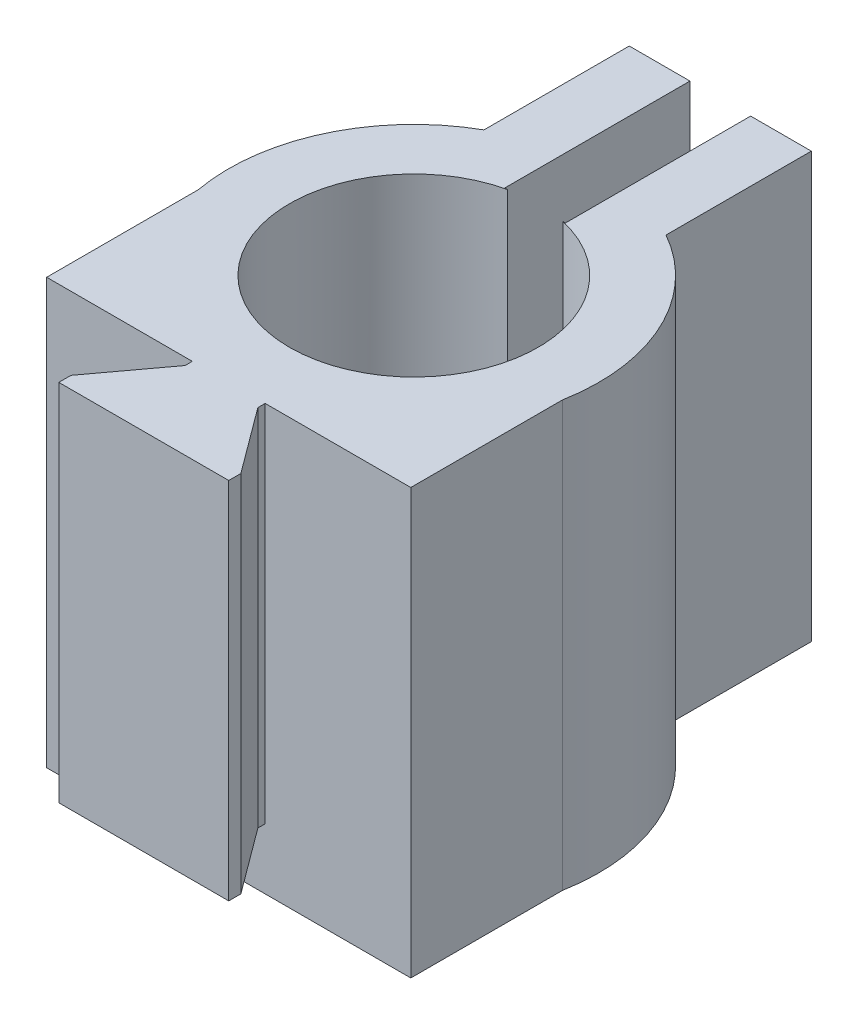
ISO-10303-21;
HEADER;
FILE_DESCRIPTION(('STEP AP214'),'2;1');
FILE_NAME('part.step','',(''),(''),'','','');
FILE_SCHEMA(('AUTOMOTIVE_DESIGN { 1 0 10303 214 1 1 1 1 }'));
ENDSEC;
DATA;
#1=APPLICATION_CONTEXT('core data for automotive mechanical design processes');
#2=APPLICATION_PROTOCOL_DEFINITION('international standard','automotive_design',2000,#1);
#3=PRODUCT_CONTEXT('',#1,'mechanical');
#4=PRODUCT('Part','Part','',(#3));
#5=PRODUCT_RELATED_PRODUCT_CATEGORY('part','',(#4));
#6=PRODUCT_DEFINITION_FORMATION('','',#4);
#7=PRODUCT_DEFINITION_CONTEXT('part definition',#1,'design');
#8=PRODUCT_DEFINITION('design','',#6,#7);
#9=PRODUCT_DEFINITION_SHAPE('','',#8);
#10=(LENGTH_UNIT() NAMED_UNIT(*) SI_UNIT(.MILLI.,.METRE.));
#11=(NAMED_UNIT(*) PLANE_ANGLE_UNIT() SI_UNIT($,.RADIAN.));
#12=(NAMED_UNIT(*) SI_UNIT($,.STERADIAN.) SOLID_ANGLE_UNIT());
#13=UNCERTAINTY_MEASURE_WITH_UNIT(LENGTH_MEASURE(1.E-05),#10,'distance_accuracy_value','');
#14=(GEOMETRIC_REPRESENTATION_CONTEXT(3) GLOBAL_UNCERTAINTY_ASSIGNED_CONTEXT((#13)) GLOBAL_UNIT_ASSIGNED_CONTEXT((#10,
#11,#12)) REPRESENTATION_CONTEXT('',''));
#15=CARTESIAN_POINT('',(0.,0.,0.));
#16=DIRECTION('',(0.,0.,1.));
#17=DIRECTION('',(1.,0.,0.));
#18=AXIS2_PLACEMENT_3D('',#15,#16,#17);
#19=CARTESIAN_POINT('',(0.,0.,0.));
#20=DIRECTION('',(0.,1.,0.));
#21=DIRECTION('',(0.,0.,1.));
#22=AXIS2_PLACEMENT_3D('',#19,#20,#21);
#23=PLANE('',#22);
#24=DIRECTION('',(-1.,0.,0.));
#25=VECTOR('',#24,1.);
#26=CARTESIAN_POINT('',(-15.,0.,15.25));
#27=LINE('',#26,#25);
#28=CARTESIAN_POINT('',(3.,0.,15.25));
#29=VERTEX_POINT('',#28);
#30=CARTESIAN_POINT('',(-3.,0.,15.25));
#31=VERTEX_POINT('',#30);
#32=EDGE_CURVE('E11',#29,#31,#27,.T.);
#33=ORIENTED_EDGE('',*,*,#32,.F.);
#34=DIRECTION('',(0.,0.,1.));
#35=VECTOR('',#34,1.);
#36=CARTESIAN_POINT('',(3.,0.,0.));
#37=LINE('',#36,#35);
#38=CARTESIAN_POINT('',(3.,0.,15.85));
#39=VERTEX_POINT('',#38);
#40=EDGE_CURVE('E270',#29,#39,#37,.T.);
#41=ORIENTED_EDGE('',*,*,#40,.T.);
#42=DIRECTION('',(-0.595227550625737,0.,-0.803557193344746));
#43=VECTOR('',#42,1.);
#44=CARTESIAN_POINT('',(-5.64393268379096,0.,4.18069087688219));
#45=LINE('',#44,#43);
#46=CARTESIAN_POINT('',(7.,0.,21.25));
#47=VERTEX_POINT('',#46);
#48=EDGE_CURVE('E267',#47,#39,#45,.T.);
#49=ORIENTED_EDGE('',*,*,#48,.F.);
#50=DIRECTION('',(0.,0.,-1.));
#51=VECTOR('',#50,1.);
#52=CARTESIAN_POINT('',(7.,0.,0.));
#53=LINE('',#52,#51);
#54=CARTESIAN_POINT('',(7.,0.,22.25));
#55=VERTEX_POINT('',#54);
#56=EDGE_CURVE('E264',#55,#47,#53,.T.);
#57=ORIENTED_EDGE('',*,*,#56,.F.);
#58=DIRECTION('',(1.,0.,0.));
#59=VECTOR('',#58,1.);
#60=CARTESIAN_POINT('',(0.,0.,22.25));
#61=LINE('',#60,#59);
#62=CARTESIAN_POINT('',(-7.,0.,22.25));
#63=VERTEX_POINT('',#62);
#64=EDGE_CURVE('E260',#63,#55,#61,.T.);
#65=ORIENTED_EDGE('',*,*,#64,.F.);
#66=DIRECTION('',(0.,0.,-1.));
#67=VECTOR('',#66,1.);
#68=CARTESIAN_POINT('',(-7.,0.,0.));
#69=LINE('',#68,#67);
#70=CARTESIAN_POINT('',(-7.,0.,21.25));
#71=VERTEX_POINT('',#70);
#72=EDGE_CURVE('E258',#63,#71,#69,.T.);
#73=ORIENTED_EDGE('',*,*,#72,.T.);
#74=DIRECTION('',(-0.595227550625737,0.,0.803557193344746));
#75=VECTOR('',#74,1.);
#76=CARTESIAN_POINT('',(5.64393268379096,0.,4.18069087688219));
#77=LINE('',#76,#75);
#78=CARTESIAN_POINT('',(-3.,0.,15.85));
#79=VERTEX_POINT('',#78);
#80=EDGE_CURVE('E271',#79,#71,#77,.T.);
#81=ORIENTED_EDGE('',*,*,#80,.F.);
#82=DIRECTION('',(0.,0.,1.));
#83=VECTOR('',#82,1.);
#84=CARTESIAN_POINT('',(-3.,0.,0.));
#85=LINE('',#84,#83);
#86=EDGE_CURVE('E275',#31,#79,#85,.T.);
#87=ORIENTED_EDGE('',*,*,#86,.F.);
#88=EDGE_LOOP('',(#33,#41,#49,#57,#65,#73,#81,#87));
#89=FACE_BOUND('',#88,.T.);
#90=ADVANCED_FACE('F35',(#89),#23,.F.);
#91=CARTESIAN_POINT('',(0.,0.,-0.0254064121598483));
#92=DIRECTION('',(0.,1.,0.));
#93=DIRECTION('',(0.,0.,-1.));
#94=AXIS2_PLACEMENT_3D('',#91,#92,#93);
#95=CIRCLE('',#94,10.2754064121598);
#96=CARTESIAN_POINT('',(-2.5,0.,-9.99204962515066));
#97=VERTEX_POINT('',#96);
#98=CARTESIAN_POINT('',(-1.22475389891966E-12,0.,10.25));
#99=VERTEX_POINT('',#98);
#100=EDGE_CURVE('E223',#97,#99,#95,.T.);
#101=ORIENTED_EDGE('',*,*,#100,.F.);
#102=DIRECTION('',(-1.,0.,0.));
#103=VECTOR('',#102,1.);
#104=CARTESIAN_POINT('',(-2.5,0.,-9.99204962515066));
#105=LINE('',#104,#103);
#106=CARTESIAN_POINT('',(-2.2850479838565,0.,-9.99204962515066));
#107=VERTEX_POINT('',#106);
#108=EDGE_CURVE('E303',#107,#97,#105,.T.);
#109=ORIENTED_EDGE('',*,*,#108,.F.);
#110=CARTESIAN_POINT('',(0.,0.,0.));
#111=DIRECTION('',(0.,1.,0.));
#112=DIRECTION('',(0.,0.,1.));
#113=AXIS2_PLACEMENT_3D('',#110,#111,#112);
#114=CIRCLE('',#113,10.25);
#115=EDGE_CURVE('E360',#107,#99,#114,.T.);
#116=ORIENTED_EDGE('',*,*,#115,.T.);
#117=EDGE_LOOP('',(#101,#109,#116));
#118=FACE_BOUND('',#117,.T.);
#119=ADVANCED_FACE('F446',(#118),#23,.F.);
#120=CARTESIAN_POINT('',(2.5,0.,-9.99204962515066));
#121=VERTEX_POINT('',#120);
#122=EDGE_CURVE('E44',#99,#121,#95,.T.);
#123=ORIENTED_EDGE('',*,*,#122,.F.);
#124=CARTESIAN_POINT('',(2.2850479838565,0.,-9.99204962515066));
#125=VERTEX_POINT('',#124);
#126=EDGE_CURVE('E354',#99,#125,#114,.T.);
#127=ORIENTED_EDGE('',*,*,#126,.T.);
#128=EDGE_CURVE('E323',#121,#125,#105,.T.);
#129=ORIENTED_EDGE('',*,*,#128,.F.);
#130=EDGE_LOOP('',(#123,#127,#129));
#131=FACE_BOUND('',#130,.T.);
#132=ADVANCED_FACE('F478',(#131),#23,.F.);
#133=CARTESIAN_POINT('',(0.,30.,0.));
#134=DIRECTION('',(0.,-1.,0.));
#135=DIRECTION('',(0.,0.,-1.));
#136=AXIS2_PLACEMENT_3D('',#133,#134,#135);
#137=CYLINDRICAL_SURFACE('',#136,15.25);
#138=DIRECTION('',(0.,1.,0.));
#139=VECTOR('',#138,1.);
#140=CARTESIAN_POINT('',(-15.,0.,2.75));
#141=LINE('',#140,#139);
#142=CARTESIAN_POINT('',(-15.,-5.,2.75));
#143=VERTEX_POINT('',#142);
#144=CARTESIAN_POINT('',(-15.,30.,2.75));
#145=VERTEX_POINT('',#144);
#146=EDGE_CURVE('E195',#143,#145,#141,.T.);
#147=ORIENTED_EDGE('',*,*,#146,.T.);
#148=CARTESIAN_POINT('',(0.,30.,0.));
#149=DIRECTION('',(0.,1.,0.));
#150=DIRECTION('',(0.,0.,1.));
#151=AXIS2_PLACEMENT_3D('',#148,#149,#150);
#152=CIRCLE('',#151,15.25);
#153=CARTESIAN_POINT('',(-7.5,30.,-13.2782717248895));
#154=VERTEX_POINT('',#153);
#155=EDGE_CURVE('E363',#154,#145,#152,.T.);
#156=ORIENTED_EDGE('',*,*,#155,.F.);
#157=DIRECTION('',(0.,-1.,0.));
#158=VECTOR('',#157,1.);
#159=CARTESIAN_POINT('',(-7.5,30.,-13.2782717248895));
#160=LINE('',#159,#158);
#161=CARTESIAN_POINT('',(-7.5,-5.,-13.2782717248895));
#162=VERTEX_POINT('',#161);
#163=EDGE_CURVE('E212',#154,#162,#160,.T.);
#164=ORIENTED_EDGE('',*,*,#163,.T.);
#165=CARTESIAN_POINT('',(0.,-5.,0.));
#166=DIRECTION('',(0.,-1.,0.));
#167=DIRECTION('',(0.,0.,1.));
#168=AXIS2_PLACEMENT_3D('',#165,#166,#167);
#169=CIRCLE('',#168,15.25);
#170=EDGE_CURVE('E209',#143,#162,#169,.T.);
#171=ORIENTED_EDGE('',*,*,#170,.F.);
#172=EDGE_LOOP('',(#147,#156,#164,#171));
#173=FACE_BOUND('',#172,.T.);
#174=ADVANCED_FACE('F210',(#173),#137,.T.);
#175=CARTESIAN_POINT('',(-7.5,30.,-25.25));
#176=DIRECTION('',(0.,0.,-1.));
#177=DIRECTION('',(-1.,0.,0.));
#178=AXIS2_PLACEMENT_3D('',#175,#176,#177);
#179=PLANE('',#178);
#180=DIRECTION('',(0.,-1.,0.));
#181=VECTOR('',#180,1.);
#182=CARTESIAN_POINT('',(-2.5,30.,-25.25));
#183=LINE('',#182,#181);
#184=CARTESIAN_POINT('',(-2.5,30.,-25.25));
#185=VERTEX_POINT('',#184);
#186=CARTESIAN_POINT('',(-2.5,-5.,-25.25));
#187=VERTEX_POINT('',#186);
#188=EDGE_CURVE('E330',#185,#187,#183,.T.);
#189=ORIENTED_EDGE('',*,*,#188,.T.);
#190=DIRECTION('',(1.,0.,0.));
#191=VECTOR('',#190,1.);
#192=CARTESIAN_POINT('',(-2.5,-5.,-25.25));
#193=LINE('',#192,#191);
#194=CARTESIAN_POINT('',(-7.5,-5.,-25.25));
#195=VERTEX_POINT('',#194);
#196=EDGE_CURVE('E229',#195,#187,#193,.T.);
#197=ORIENTED_EDGE('',*,*,#196,.F.);
#198=DIRECTION('',(0.,-1.,0.));
#199=VECTOR('',#198,1.);
#200=CARTESIAN_POINT('',(-7.5,30.,-25.25));
#201=LINE('',#200,#199);
#202=CARTESIAN_POINT('',(-7.5,30.,-25.25));
#203=VERTEX_POINT('',#202);
#204=EDGE_CURVE('E351',#203,#195,#201,.T.);
#205=ORIENTED_EDGE('',*,*,#204,.F.);
#206=DIRECTION('',(1.,0.,0.));
#207=VECTOR('',#206,1.);
#208=CARTESIAN_POINT('',(-7.5,30.,-25.25));
#209=LINE('',#208,#207);
#210=EDGE_CURVE('E345',#203,#185,#209,.T.);
#211=ORIENTED_EDGE('',*,*,#210,.T.);
#212=EDGE_LOOP('',(#189,#197,#205,#211));
#213=FACE_BOUND('',#212,.T.);
#214=ADVANCED_FACE('F429',(#213),#179,.T.);
#215=CARTESIAN_POINT('',(0.,30.,0.));
#216=DIRECTION('',(0.,1.,0.));
#217=DIRECTION('',(0.,0.,1.));
#218=AXIS2_PLACEMENT_3D('',#215,#216,#217);
#219=PLANE('',#218);
#220=DIRECTION('',(0.,0.,-1.));
#221=VECTOR('',#220,1.);
#222=CARTESIAN_POINT('',(-2.5,30.,-25.25));
#223=LINE('',#222,#221);
#224=CARTESIAN_POINT('',(-2.5,30.,-9.99204962515066));
#225=VERTEX_POINT('',#224);
#226=EDGE_CURVE('E319',#225,#185,#223,.T.);
#227=ORIENTED_EDGE('',*,*,#226,.T.);
#228=ORIENTED_EDGE('',*,*,#210,.F.);
#229=DIRECTION('',(0.,0.,-1.));
#230=VECTOR('',#229,1.);
#231=CARTESIAN_POINT('',(-7.5,30.,-10.25));
#232=LINE('',#231,#230);
#233=EDGE_CURVE('E336',#154,#203,#232,.T.);
#234=ORIENTED_EDGE('',*,*,#233,.F.);
#235=ORIENTED_EDGE('',*,*,#155,.T.);
#236=DIRECTION('',(0.,0.,-1.));
#237=VECTOR('',#236,1.);
#238=CARTESIAN_POINT('',(-15.,30.,0.));
#239=LINE('',#238,#237);
#240=CARTESIAN_POINT('',(-15.,30.,15.25));
#241=VERTEX_POINT('',#240);
#242=EDGE_CURVE('E202',#241,#145,#239,.T.);
#243=ORIENTED_EDGE('',*,*,#242,.F.);
#244=DIRECTION('',(-1.,0.,0.));
#245=VECTOR('',#244,1.);
#246=CARTESIAN_POINT('',(0.,30.,15.25));
#247=LINE('',#246,#245);
#248=CARTESIAN_POINT('',(-3.,30.,15.25));
#249=VERTEX_POINT('',#248);
#250=EDGE_CURVE('E294',#249,#241,#247,.T.);
#251=ORIENTED_EDGE('',*,*,#250,.F.);
#252=DIRECTION('',(0.,0.,1.));
#253=VECTOR('',#252,1.);
#254=CARTESIAN_POINT('',(-3.,30.,0.));
#255=LINE('',#254,#253);
#256=CARTESIAN_POINT('',(-3.,30.,15.85));
#257=VERTEX_POINT('',#256);
#258=EDGE_CURVE('E296',#249,#257,#255,.T.);
#259=ORIENTED_EDGE('',*,*,#258,.T.);
#260=DIRECTION('',(-0.595227550625737,0.,0.803557193344746));
#261=VECTOR('',#260,1.);
#262=CARTESIAN_POINT('',(5.64393268379096,30.,4.18069087688219));
#263=LINE('',#262,#261);
#264=CARTESIAN_POINT('',(-7.,30.,21.25));
#265=VERTEX_POINT('',#264);
#266=EDGE_CURVE('E261',#257,#265,#263,.T.);
#267=ORIENTED_EDGE('',*,*,#266,.T.);
#268=DIRECTION('',(0.,0.,-1.));
#269=VECTOR('',#268,1.);
#270=CARTESIAN_POINT('',(-7.,30.,0.));
#271=LINE('',#270,#269);
#272=CARTESIAN_POINT('',(-7.,30.,22.25));
#273=VERTEX_POINT('',#272);
#274=EDGE_CURVE('E257',#273,#265,#271,.T.);
#275=ORIENTED_EDGE('',*,*,#274,.F.);
#276=DIRECTION('',(1.,0.,0.));
#277=VECTOR('',#276,1.);
#278=CARTESIAN_POINT('',(0.,30.,22.25));
#279=LINE('',#278,#277);
#280=CARTESIAN_POINT('',(7.,30.,22.25));
#281=VERTEX_POINT('',#280);
#282=EDGE_CURVE('E278',#273,#281,#279,.T.);
#283=ORIENTED_EDGE('',*,*,#282,.T.);
#284=DIRECTION('',(0.,0.,-1.));
#285=VECTOR('',#284,1.);
#286=CARTESIAN_POINT('',(7.,30.,0.));
#287=LINE('',#286,#285);
#288=CARTESIAN_POINT('',(7.,30.,21.25));
#289=VERTEX_POINT('',#288);
#290=EDGE_CURVE('E281',#281,#289,#287,.T.);
#291=ORIENTED_EDGE('',*,*,#290,.T.);
#292=DIRECTION('',(-0.595227550625737,0.,-0.803557193344746));
#293=VECTOR('',#292,1.);
#294=CARTESIAN_POINT('',(-5.64393268379096,30.,4.18069087688219));
#295=LINE('',#294,#293);
#296=CARTESIAN_POINT('',(3.,30.,15.85));
#297=VERTEX_POINT('',#296);
#298=EDGE_CURVE('E284',#289,#297,#295,.T.);
#299=ORIENTED_EDGE('',*,*,#298,.T.);
#300=DIRECTION('',(0.,0.,1.));
#301=VECTOR('',#300,1.);
#302=CARTESIAN_POINT('',(3.,30.,0.));
#303=LINE('',#302,#301);
#304=CARTESIAN_POINT('',(3.,30.,15.25));
#305=VERTEX_POINT('',#304);
#306=EDGE_CURVE('E287',#305,#297,#303,.T.);
#307=ORIENTED_EDGE('',*,*,#306,.F.);
#308=DIRECTION('',(-1.,0.,0.));
#309=VECTOR('',#308,1.);
#310=CARTESIAN_POINT('',(0.,30.,15.25));
#311=LINE('',#310,#309);
#312=CARTESIAN_POINT('',(15.,30.,15.25));
#313=VERTEX_POINT('',#312);
#314=EDGE_CURVE('E290',#313,#305,#311,.T.);
#315=ORIENTED_EDGE('',*,*,#314,.F.);
#316=DIRECTION('',(0.,0.,-1.));
#317=VECTOR('',#316,1.);
#318=CARTESIAN_POINT('',(15.,30.,0.));
#319=LINE('',#318,#317);
#320=CARTESIAN_POINT('',(15.,30.,2.75));
#321=VERTEX_POINT('',#320);
#322=EDGE_CURVE('E59',#313,#321,#319,.T.);
#323=ORIENTED_EDGE('',*,*,#322,.T.);
#324=CARTESIAN_POINT('',(7.5,30.,-13.2782717248895));
#325=VERTEX_POINT('',#324);
#326=EDGE_CURVE('E359',#321,#325,#152,.T.);
#327=ORIENTED_EDGE('',*,*,#326,.T.);
#328=DIRECTION('',(0.,0.,1.));
#329=VECTOR('',#328,1.);
#330=CARTESIAN_POINT('',(7.5,30.,-10.25));
#331=LINE('',#330,#329);
#332=CARTESIAN_POINT('',(7.5,30.,-25.25));
#333=VERTEX_POINT('',#332);
#334=EDGE_CURVE('E348',#333,#325,#331,.T.);
#335=ORIENTED_EDGE('',*,*,#334,.F.);
#336=CARTESIAN_POINT('',(2.5,30.,-25.25));
#337=VERTEX_POINT('',#336);
#338=EDGE_CURVE('E344',#337,#333,#209,.T.);
#339=ORIENTED_EDGE('',*,*,#338,.F.);
#340=DIRECTION('',(0.,0.,1.));
#341=VECTOR('',#340,1.);
#342=CARTESIAN_POINT('',(2.5,30.,-25.25));
#343=LINE('',#342,#341);
#344=CARTESIAN_POINT('',(2.5,30.,-9.99204962515066));
#345=VERTEX_POINT('',#344);
#346=EDGE_CURVE('E322',#337,#345,#343,.T.);
#347=ORIENTED_EDGE('',*,*,#346,.T.);
#348=DIRECTION('',(-1.,0.,0.));
#349=VECTOR('',#348,1.);
#350=CARTESIAN_POINT('',(-2.5,30.,-9.99204962515066));
#351=LINE('',#350,#349);
#352=CARTESIAN_POINT('',(2.2850479838565,30.,-9.99204962515066));
#353=VERTEX_POINT('',#352);
#354=EDGE_CURVE('E327',#345,#353,#351,.T.);
#355=ORIENTED_EDGE('',*,*,#354,.T.);
#356=CARTESIAN_POINT('',(0.,30.,0.));
#357=DIRECTION('',(0.,1.,0.));
#358=DIRECTION('',(0.,0.,1.));
#359=AXIS2_PLACEMENT_3D('',#356,#357,#358);
#360=CIRCLE('',#359,10.25);
#361=CARTESIAN_POINT('',(-2.2850479838565,30.,-9.99204962515066));
#362=VERTEX_POINT('',#361);
#363=EDGE_CURVE('E356',#362,#353,#360,.T.);
#364=ORIENTED_EDGE('',*,*,#363,.F.);
#365=EDGE_CURVE('E326',#362,#225,#351,.T.);
#366=ORIENTED_EDGE('',*,*,#365,.T.);
#367=EDGE_LOOP('',(#227,#228,#234,#235,#243,#251,#259,#267,#275,#283,#291,#299,#307,#315,#323,
#327,#335,#339,#347,#355,#364,#366));
#368=FACE_BOUND('',#367,.T.);
#369=ADVANCED_FACE('F420',(#368),#219,.T.);
#370=ORIENTED_EDGE('',*,*,#326,.F.);
#371=DIRECTION('',(0.,1.,0.));
#372=VECTOR('',#371,1.);
#373=CARTESIAN_POINT('',(15.,0.,2.75));
#374=LINE('',#373,#372);
#375=CARTESIAN_POINT('',(15.,-5.,2.75));
#376=VERTEX_POINT('',#375);
#377=EDGE_CURVE('E206',#376,#321,#374,.T.);
#378=ORIENTED_EDGE('',*,*,#377,.F.);
#379=CARTESIAN_POINT('',(0.,-5.,0.));
#380=DIRECTION('',(0.,-1.,0.));
#381=DIRECTION('',(0.,0.,-1.));
#382=AXIS2_PLACEMENT_3D('',#379,#380,#381);
#383=CIRCLE('',#382,15.2500000000001);
#384=CARTESIAN_POINT('',(7.5,-5.,-13.2782717248895));
#385=VERTEX_POINT('',#384);
#386=EDGE_CURVE('E245',#385,#376,#383,.T.);
#387=ORIENTED_EDGE('',*,*,#386,.F.);
#388=DIRECTION('',(0.,-1.,0.));
#389=VECTOR('',#388,1.);
#390=CARTESIAN_POINT('',(7.5,30.,-13.2782717248895));
#391=LINE('',#390,#389);
#392=EDGE_CURVE('E365',#385,#325,#391,.F.);
#393=ORIENTED_EDGE('',*,*,#392,.T.);
#394=EDGE_LOOP('',(#370,#378,#387,#393));
#395=FACE_BOUND('',#394,.T.);
#396=ADVANCED_FACE('F37',(#395),#137,.T.);
#397=CARTESIAN_POINT('',(0.,30.,0.));
#398=DIRECTION('',(0.,-1.,0.));
#399=DIRECTION('',(0.,0.,-1.));
#400=AXIS2_PLACEMENT_3D('',#397,#398,#399);
#401=CYLINDRICAL_SURFACE('',#400,10.25);
#402=DIRECTION('',(0.,-1.,0.));
#403=VECTOR('',#402,1.);
#404=CARTESIAN_POINT('',(-2.2850479838565,30.,-9.99204962515066));
#405=LINE('',#404,#403);
#406=EDGE_CURVE('E371',#362,#107,#405,.T.);
#407=ORIENTED_EDGE('',*,*,#406,.F.);
#408=ORIENTED_EDGE('',*,*,#363,.T.);
#409=DIRECTION('',(0.,-1.,0.));
#410=VECTOR('',#409,1.);
#411=CARTESIAN_POINT('',(2.2850479838565,30.,-9.99204962515066));
#412=LINE('',#411,#410);
#413=EDGE_CURVE('E369',#125,#353,#412,.F.);
#414=ORIENTED_EDGE('',*,*,#413,.F.);
#415=ORIENTED_EDGE('',*,*,#126,.F.);
#416=ORIENTED_EDGE('',*,*,#115,.F.);
#417=EDGE_LOOP('',(#407,#408,#414,#415,#416));
#418=FACE_BOUND('',#417,.T.);
#419=ADVANCED_FACE('F443',(#418),#401,.F.);
#420=CARTESIAN_POINT('',(-7.5,30.,-10.25));
#421=DIRECTION('',(-1.,0.,0.));
#422=DIRECTION('',(0.,0.,1.));
#423=AXIS2_PLACEMENT_3D('',#420,#421,#422);
#424=PLANE('',#423);
#425=ORIENTED_EDGE('',*,*,#163,.F.);
#426=ORIENTED_EDGE('',*,*,#233,.T.);
#427=ORIENTED_EDGE('',*,*,#204,.T.);
#428=DIRECTION('',(0.,0.,-1.));
#429=VECTOR('',#428,1.);
#430=CARTESIAN_POINT('',(-7.5,-5.,-25.25));
#431=LINE('',#430,#429);
#432=EDGE_CURVE('E216',#162,#195,#431,.T.);
#433=ORIENTED_EDGE('',*,*,#432,.F.);
#434=EDGE_LOOP('',(#425,#426,#427,#433));
#435=FACE_BOUND('',#434,.T.);
#436=ADVANCED_FACE('F424',(#435),#424,.T.);
#437=CARTESIAN_POINT('',(7.5,30.,-10.25));
#438=DIRECTION('',(1.,0.,0.));
#439=DIRECTION('',(0.,0.,-1.));
#440=AXIS2_PLACEMENT_3D('',#437,#438,#439);
#441=PLANE('',#440);
#442=ORIENTED_EDGE('',*,*,#392,.F.);
#443=DIRECTION('',(0.,0.,1.));
#444=VECTOR('',#443,1.);
#445=CARTESIAN_POINT('',(7.5,-5.,-25.25));
#446=LINE('',#445,#444);
#447=CARTESIAN_POINT('',(7.5,-5.,-25.25));
#448=VERTEX_POINT('',#447);
#449=EDGE_CURVE('E242',#448,#385,#446,.T.);
#450=ORIENTED_EDGE('',*,*,#449,.F.);
#451=DIRECTION('',(0.,-1.,0.));
#452=VECTOR('',#451,1.);
#453=CARTESIAN_POINT('',(7.5,30.,-25.25));
#454=LINE('',#453,#452);
#455=EDGE_CURVE('E352',#333,#448,#454,.T.);
#456=ORIENTED_EDGE('',*,*,#455,.F.);
#457=ORIENTED_EDGE('',*,*,#334,.T.);
#458=EDGE_LOOP('',(#442,#450,#456,#457));
#459=FACE_BOUND('',#458,.T.);
#460=ADVANCED_FACE('F462',(#459),#441,.T.);
#461=DIRECTION('',(0.,-1.,0.));
#462=VECTOR('',#461,1.);
#463=CARTESIAN_POINT('',(2.5,30.,-25.25));
#464=LINE('',#463,#462);
#465=CARTESIAN_POINT('',(2.5,-5.,-25.25));
#466=VERTEX_POINT('',#465);
#467=EDGE_CURVE('E340',#337,#466,#464,.T.);
#468=ORIENTED_EDGE('',*,*,#467,.F.);
#469=ORIENTED_EDGE('',*,*,#338,.T.);
#470=ORIENTED_EDGE('',*,*,#455,.T.);
#471=DIRECTION('',(1.,0.,0.));
#472=VECTOR('',#471,1.);
#473=CARTESIAN_POINT('',(2.5,-5.,-25.25));
#474=LINE('',#473,#472);
#475=EDGE_CURVE('E239',#466,#448,#474,.T.);
#476=ORIENTED_EDGE('',*,*,#475,.F.);
#477=EDGE_LOOP('',(#468,#469,#470,#476));
#478=FACE_BOUND('',#477,.T.);
#479=ADVANCED_FACE('F457',(#478),#179,.T.);
#480=CARTESIAN_POINT('',(2.5,30.,-25.25));
#481=DIRECTION('',(1.,0.,0.));
#482=DIRECTION('',(0.,0.,-1.));
#483=AXIS2_PLACEMENT_3D('',#480,#481,#482);
#484=PLANE('',#483);
#485=ORIENTED_EDGE('',*,*,#467,.T.);
#486=DIRECTION('',(0.,0.,-1.));
#487=VECTOR('',#486,1.);
#488=CARTESIAN_POINT('',(2.5,-5.,-9.99204962515066));
#489=LINE('',#488,#487);
#490=CARTESIAN_POINT('',(2.5,-5.,-9.99204962515066));
#491=VERTEX_POINT('',#490);
#492=EDGE_CURVE('E236',#491,#466,#489,.T.);
#493=ORIENTED_EDGE('',*,*,#492,.F.);
#494=DIRECTION('',(0.,1.,0.));
#495=VECTOR('',#494,1.);
#496=CARTESIAN_POINT('',(2.5,-5.,-9.99204962515066));
#497=LINE('',#496,#495);
#498=EDGE_CURVE('E250',#491,#121,#497,.T.);
#499=ORIENTED_EDGE('',*,*,#498,.T.);
#500=DIRECTION('',(0.,-1.,0.));
#501=VECTOR('',#500,1.);
#502=CARTESIAN_POINT('',(2.5,30.,-9.99204962515066));
#503=LINE('',#502,#501);
#504=EDGE_CURVE('E337',#345,#121,#503,.T.);
#505=ORIENTED_EDGE('',*,*,#504,.F.);
#506=ORIENTED_EDGE('',*,*,#346,.F.);
#507=EDGE_LOOP('',(#485,#493,#499,#505,#506));
#508=FACE_BOUND('',#507,.T.);
#509=ADVANCED_FACE('F503',(#508),#484,.F.);
#510=CARTESIAN_POINT('',(-2.5,30.,-9.99204962515066));
#511=DIRECTION('',(0.,0.,1.));
#512=DIRECTION('',(1.,0.,0.));
#513=AXIS2_PLACEMENT_3D('',#510,#511,#512);
#514=PLANE('',#513);
#515=ORIENTED_EDGE('',*,*,#413,.T.);
#516=ORIENTED_EDGE('',*,*,#354,.F.);
#517=ORIENTED_EDGE('',*,*,#504,.T.);
#518=ORIENTED_EDGE('',*,*,#128,.T.);
#519=EDGE_LOOP('',(#515,#516,#517,#518));
#520=FACE_BOUND('',#519,.T.);
#521=ADVANCED_FACE('F510',(#520),#514,.F.);
#522=ORIENTED_EDGE('',*,*,#406,.T.);
#523=ORIENTED_EDGE('',*,*,#108,.T.);
#524=DIRECTION('',(0.,-1.,0.));
#525=VECTOR('',#524,1.);
#526=CARTESIAN_POINT('',(-2.5,30.,-9.99204962515066));
#527=LINE('',#526,#525);
#528=EDGE_CURVE('E333',#225,#97,#527,.T.);
#529=ORIENTED_EDGE('',*,*,#528,.F.);
#530=ORIENTED_EDGE('',*,*,#365,.F.);
#531=EDGE_LOOP('',(#522,#523,#529,#530));
#532=FACE_BOUND('',#531,.T.);
#533=ADVANCED_FACE('F438',(#532),#514,.F.);
#534=CARTESIAN_POINT('',(-2.5,30.,-25.25));
#535=DIRECTION('',(-1.,0.,0.));
#536=DIRECTION('',(0.,0.,1.));
#537=AXIS2_PLACEMENT_3D('',#534,#535,#536);
#538=PLANE('',#537);
#539=ORIENTED_EDGE('',*,*,#528,.T.);
#540=DIRECTION('',(0.,1.,0.));
#541=VECTOR('',#540,1.);
#542=CARTESIAN_POINT('',(-2.5,-5.,-9.99204962515065));
#543=LINE('',#542,#541);
#544=CARTESIAN_POINT('',(-2.5,-5.,-9.99204962515065));
#545=VERTEX_POINT('',#544);
#546=EDGE_CURVE('E254',#545,#97,#543,.T.);
#547=ORIENTED_EDGE('',*,*,#546,.F.);
#548=DIRECTION('',(0.,0.,1.));
#549=VECTOR('',#548,1.);
#550=CARTESIAN_POINT('',(-2.5,-5.,-9.99204962515066));
#551=LINE('',#550,#549);
#552=EDGE_CURVE('E232',#187,#545,#551,.T.);
#553=ORIENTED_EDGE('',*,*,#552,.F.);
#554=ORIENTED_EDGE('',*,*,#188,.F.);
#555=ORIENTED_EDGE('',*,*,#226,.F.);
#556=EDGE_LOOP('',(#539,#547,#553,#554,#555));
#557=FACE_BOUND('',#556,.T.);
#558=ADVANCED_FACE('F432',(#557),#538,.F.);
#559=CARTESIAN_POINT('',(-7.,0.,0.));
#560=DIRECTION('',(1.,0.,0.));
#561=DIRECTION('',(0.,0.,-1.));
#562=AXIS2_PLACEMENT_3D('',#559,#560,#561);
#563=PLANE('',#562);
#564=ORIENTED_EDGE('',*,*,#274,.T.);
#565=DIRECTION('',(0.,1.,0.));
#566=VECTOR('',#565,1.);
#567=CARTESIAN_POINT('',(-7.,0.,21.25));
#568=LINE('',#567,#566);
#569=EDGE_CURVE('E301',#71,#265,#568,.T.);
#570=ORIENTED_EDGE('',*,*,#569,.F.);
#571=ORIENTED_EDGE('',*,*,#72,.F.);
#572=DIRECTION('',(0.,1.,0.));
#573=VECTOR('',#572,1.);
#574=CARTESIAN_POINT('',(-7.,0.,22.25));
#575=LINE('',#574,#573);
#576=EDGE_CURVE('E274',#63,#273,#575,.T.);
#577=ORIENTED_EDGE('',*,*,#576,.T.);
#578=EDGE_LOOP('',(#564,#570,#571,#577));
#579=FACE_BOUND('',#578,.T.);
#580=ADVANCED_FACE('F409',(#579),#563,.F.);
#581=CARTESIAN_POINT('',(5.64393268379096,0.,4.18069087688219));
#582=DIRECTION('',(-0.803557193344746,0.,-0.595227550625737));
#583=DIRECTION('',(-0.595227550625737,0.,0.803557193344746));
#584=AXIS2_PLACEMENT_3D('',#581,#582,#583);
#585=PLANE('',#584);
#586=ORIENTED_EDGE('',*,*,#266,.F.);
#587=DIRECTION('',(0.,1.,0.));
#588=VECTOR('',#587,1.);
#589=CARTESIAN_POINT('',(-3.,0.,15.85));
#590=LINE('',#589,#588);
#591=EDGE_CURVE('E304',#79,#257,#590,.T.);
#592=ORIENTED_EDGE('',*,*,#591,.F.);
#593=ORIENTED_EDGE('',*,*,#80,.T.);
#594=ORIENTED_EDGE('',*,*,#569,.T.);
#595=EDGE_LOOP('',(#586,#592,#593,#594));
#596=FACE_BOUND('',#595,.T.);
#597=ADVANCED_FACE('F413',(#596),#585,.T.);
#598=CARTESIAN_POINT('',(-3.,0.,0.));
#599=DIRECTION('',(-1.,0.,0.));
#600=DIRECTION('',(0.,0.,1.));
#601=AXIS2_PLACEMENT_3D('',#598,#599,#600);
#602=PLANE('',#601);
#603=ORIENTED_EDGE('',*,*,#258,.F.);
#604=DIRECTION('',(0.,1.,0.));
#605=VECTOR('',#604,1.);
#606=CARTESIAN_POINT('',(-3.,0.,15.25));
#607=LINE('',#606,#605);
#608=EDGE_CURVE('E306',#31,#249,#607,.T.);
#609=ORIENTED_EDGE('',*,*,#608,.F.);
#610=ORIENTED_EDGE('',*,*,#86,.T.);
#611=ORIENTED_EDGE('',*,*,#591,.T.);
#612=EDGE_LOOP('',(#603,#609,#610,#611));
#613=FACE_BOUND('',#612,.T.);
#614=ADVANCED_FACE('F416',(#613),#602,.T.);
#615=CARTESIAN_POINT('',(0.,0.,15.25));
#616=DIRECTION('',(0.,0.,-1.));
#617=DIRECTION('',(-1.,0.,0.));
#618=AXIS2_PLACEMENT_3D('',#615,#616,#617);
#619=PLANE('',#618);
#620=ORIENTED_EDGE('',*,*,#250,.T.);
#621=DIRECTION('',(0.,1.,0.));
#622=VECTOR('',#621,1.);
#623=CARTESIAN_POINT('',(-15.,0.,15.25));
#624=LINE('',#623,#622);
#625=CARTESIAN_POINT('',(-15.,-5.,15.25));
#626=VERTEX_POINT('',#625);
#627=EDGE_CURVE('E205',#626,#241,#624,.T.);
#628=ORIENTED_EDGE('',*,*,#627,.F.);
#629=DIRECTION('',(-1.,0.,0.));
#630=VECTOR('',#629,1.);
#631=CARTESIAN_POINT('',(-15.,-5.,15.25));
#632=LINE('',#631,#630);
#633=CARTESIAN_POINT('',(15.,-5.,15.25));
#634=VERTEX_POINT('',#633);
#635=EDGE_CURVE('E222',#634,#626,#632,.T.);
#636=ORIENTED_EDGE('',*,*,#635,.F.);
#637=DIRECTION('',(0.,1.,0.));
#638=VECTOR('',#637,1.);
#639=CARTESIAN_POINT('',(15.,0.,15.25));
#640=LINE('',#639,#638);
#641=EDGE_CURVE('E309',#634,#313,#640,.T.);
#642=ORIENTED_EDGE('',*,*,#641,.T.);
#643=ORIENTED_EDGE('',*,*,#314,.T.);
#644=DIRECTION('',(0.,1.,0.));
#645=VECTOR('',#644,1.);
#646=CARTESIAN_POINT('',(3.,0.,15.25));
#647=LINE('',#646,#645);
#648=EDGE_CURVE('E311',#29,#305,#647,.T.);
#649=ORIENTED_EDGE('',*,*,#648,.F.);
#650=ORIENTED_EDGE('',*,*,#32,.T.);
#651=ORIENTED_EDGE('',*,*,#608,.T.);
#652=EDGE_LOOP('',(#620,#628,#636,#642,#643,#649,#650,#651));
#653=FACE_BOUND('',#652,.T.);
#654=ADVANCED_FACE('F419',(#653),#619,.F.);
#655=CARTESIAN_POINT('',(-15.,0.,0.));
#656=DIRECTION('',(1.,0.,0.));
#657=DIRECTION('',(0.,0.,-1.));
#658=AXIS2_PLACEMENT_3D('',#655,#656,#657);
#659=PLANE('',#658);
#660=ORIENTED_EDGE('',*,*,#242,.T.);
#661=ORIENTED_EDGE('',*,*,#146,.F.);
#662=DIRECTION('',(0.,0.,-1.));
#663=VECTOR('',#662,1.);
#664=CARTESIAN_POINT('',(-15.,-5.,15.25));
#665=LINE('',#664,#663);
#666=EDGE_CURVE('E200',#626,#143,#665,.T.);
#667=ORIENTED_EDGE('',*,*,#666,.F.);
#668=ORIENTED_EDGE('',*,*,#627,.T.);
#669=EDGE_LOOP('',(#660,#661,#667,#668));
#670=FACE_BOUND('',#669,.T.);
#671=ADVANCED_FACE('F197',(#670),#659,.F.);
#672=CARTESIAN_POINT('',(15.,0.,0.));
#673=DIRECTION('',(1.,0.,0.));
#674=DIRECTION('',(0.,0.,-1.));
#675=AXIS2_PLACEMENT_3D('',#672,#673,#674);
#676=PLANE('',#675);
#677=ORIENTED_EDGE('',*,*,#322,.F.);
#678=ORIENTED_EDGE('',*,*,#641,.F.);
#679=DIRECTION('',(0.,0.,1.));
#680=VECTOR('',#679,1.);
#681=CARTESIAN_POINT('',(15.,-5.,15.25));
#682=LINE('',#681,#680);
#683=EDGE_CURVE('E248',#376,#634,#682,.T.);
#684=ORIENTED_EDGE('',*,*,#683,.F.);
#685=ORIENTED_EDGE('',*,*,#377,.T.);
#686=EDGE_LOOP('',(#677,#678,#684,#685));
#687=FACE_BOUND('',#686,.T.);
#688=ADVANCED_FACE('F468',(#687),#676,.T.);
#689=CARTESIAN_POINT('',(3.,0.,0.));
#690=DIRECTION('',(-1.,0.,0.));
#691=DIRECTION('',(0.,0.,1.));
#692=AXIS2_PLACEMENT_3D('',#689,#690,#691);
#693=PLANE('',#692);
#694=ORIENTED_EDGE('',*,*,#306,.T.);
#695=DIRECTION('',(0.,1.,0.));
#696=VECTOR('',#695,1.);
#697=CARTESIAN_POINT('',(3.,0.,15.85));
#698=LINE('',#697,#696);
#699=EDGE_CURVE('E312',#39,#297,#698,.T.);
#700=ORIENTED_EDGE('',*,*,#699,.F.);
#701=ORIENTED_EDGE('',*,*,#40,.F.);
#702=ORIENTED_EDGE('',*,*,#648,.T.);
#703=EDGE_LOOP('',(#694,#700,#701,#702));
#704=FACE_BOUND('',#703,.T.);
#705=ADVANCED_FACE('F393',(#704),#693,.F.);
#706=CARTESIAN_POINT('',(-5.64393268379096,0.,4.18069087688219));
#707=DIRECTION('',(0.803557193344746,0.,-0.595227550625737));
#708=DIRECTION('',(-0.595227550625737,0.,-0.803557193344746));
#709=AXIS2_PLACEMENT_3D('',#706,#707,#708);
#710=PLANE('',#709);
#711=ORIENTED_EDGE('',*,*,#298,.F.);
#712=DIRECTION('',(0.,1.,0.));
#713=VECTOR('',#712,1.);
#714=CARTESIAN_POINT('',(7.,0.,21.25));
#715=LINE('',#714,#713);
#716=EDGE_CURVE('E314',#47,#289,#715,.T.);
#717=ORIENTED_EDGE('',*,*,#716,.F.);
#718=ORIENTED_EDGE('',*,*,#48,.T.);
#719=ORIENTED_EDGE('',*,*,#699,.T.);
#720=EDGE_LOOP('',(#711,#717,#718,#719));
#721=FACE_BOUND('',#720,.T.);
#722=ADVANCED_FACE('F397',(#721),#710,.T.);
#723=CARTESIAN_POINT('',(7.,0.,0.));
#724=DIRECTION('',(1.,0.,0.));
#725=DIRECTION('',(0.,0.,-1.));
#726=AXIS2_PLACEMENT_3D('',#723,#724,#725);
#727=PLANE('',#726);
#728=ORIENTED_EDGE('',*,*,#290,.F.);
#729=DIRECTION('',(0.,1.,0.));
#730=VECTOR('',#729,1.);
#731=CARTESIAN_POINT('',(7.,0.,22.25));
#732=LINE('',#731,#730);
#733=EDGE_CURVE('E316',#55,#281,#732,.T.);
#734=ORIENTED_EDGE('',*,*,#733,.F.);
#735=ORIENTED_EDGE('',*,*,#56,.T.);
#736=ORIENTED_EDGE('',*,*,#716,.T.);
#737=EDGE_LOOP('',(#728,#734,#735,#736));
#738=FACE_BOUND('',#737,.T.);
#739=ADVANCED_FACE('F400',(#738),#727,.T.);
#740=CARTESIAN_POINT('',(0.,0.,22.25));
#741=DIRECTION('',(0.,0.,1.));
#742=DIRECTION('',(1.,0.,0.));
#743=AXIS2_PLACEMENT_3D('',#740,#741,#742);
#744=PLANE('',#743);
#745=ORIENTED_EDGE('',*,*,#282,.F.);
#746=ORIENTED_EDGE('',*,*,#576,.F.);
#747=ORIENTED_EDGE('',*,*,#64,.T.);
#748=ORIENTED_EDGE('',*,*,#733,.T.);
#749=EDGE_LOOP('',(#745,#746,#747,#748));
#750=FACE_BOUND('',#749,.T.);
#751=ADVANCED_FACE('F404',(#750),#744,.T.);
#752=CARTESIAN_POINT('',(0.,-5.,-0.0254064121598483));
#753=DIRECTION('',(0.,1.,0.));
#754=DIRECTION('',(0.,0.,1.));
#755=AXIS2_PLACEMENT_3D('',#752,#753,#754);
#756=CYLINDRICAL_SURFACE('',#755,10.2754064121598);
#757=ORIENTED_EDGE('',*,*,#100,.T.);
#758=ORIENTED_EDGE('',*,*,#122,.T.);
#759=ORIENTED_EDGE('',*,*,#498,.F.);
#760=CARTESIAN_POINT('',(0.,-5.,-0.0254064121598483));
#761=DIRECTION('',(0.,1.,0.));
#762=DIRECTION('',(0.,0.,-1.));
#763=AXIS2_PLACEMENT_3D('',#760,#761,#762);
#764=CIRCLE('',#763,10.2754064121598);
#765=EDGE_CURVE('E234',#545,#491,#764,.T.);
#766=ORIENTED_EDGE('',*,*,#765,.F.);
#767=ORIENTED_EDGE('',*,*,#546,.T.);
#768=EDGE_LOOP('',(#757,#758,#759,#766,#767));
#769=FACE_BOUND('',#768,.T.);
#770=ADVANCED_FACE('F448',(#769),#756,.F.);
#771=CARTESIAN_POINT('',(0.,-5.,0.));
#772=DIRECTION('',(0.,1.,0.));
#773=DIRECTION('',(0.,0.,1.));
#774=AXIS2_PLACEMENT_3D('',#771,#772,#773);
#775=PLANE('',#774);
#776=ORIENTED_EDGE('',*,*,#666,.T.);
#777=ORIENTED_EDGE('',*,*,#170,.T.);
#778=ORIENTED_EDGE('',*,*,#432,.T.);
#779=ORIENTED_EDGE('',*,*,#196,.T.);
#780=ORIENTED_EDGE('',*,*,#552,.T.);
#781=ORIENTED_EDGE('',*,*,#765,.T.);
#782=ORIENTED_EDGE('',*,*,#492,.T.);
#783=ORIENTED_EDGE('',*,*,#475,.T.);
#784=ORIENTED_EDGE('',*,*,#449,.T.);
#785=ORIENTED_EDGE('',*,*,#386,.T.);
#786=ORIENTED_EDGE('',*,*,#683,.T.);
#787=ORIENTED_EDGE('',*,*,#635,.T.);
#788=EDGE_LOOP('',(#776,#777,#778,#779,#780,#781,#782,#783,#784,#785,#786,#787));
#789=FACE_BOUND('',#788,.T.);
#790=ADVANCED_FACE('F219',(#789),#775,.F.);
#791=CLOSED_SHELL('',(#90,#119,#132,#174,#214,#369,#396,#419,#436,#460,#479,#509,#521,#533,#558,
#580,#597,#614,#654,#671,#688,#705,#722,#739,#751,#770,#790));
#792=MANIFOLD_SOLID_BREP('B2',#791);
#793=ADVANCED_BREP_SHAPE_REPRESENTATION('',(#18,#792),#14);
#794=SHAPE_DEFINITION_REPRESENTATION(#9,#793);
ENDSEC;
END-ISO-10303-21;
